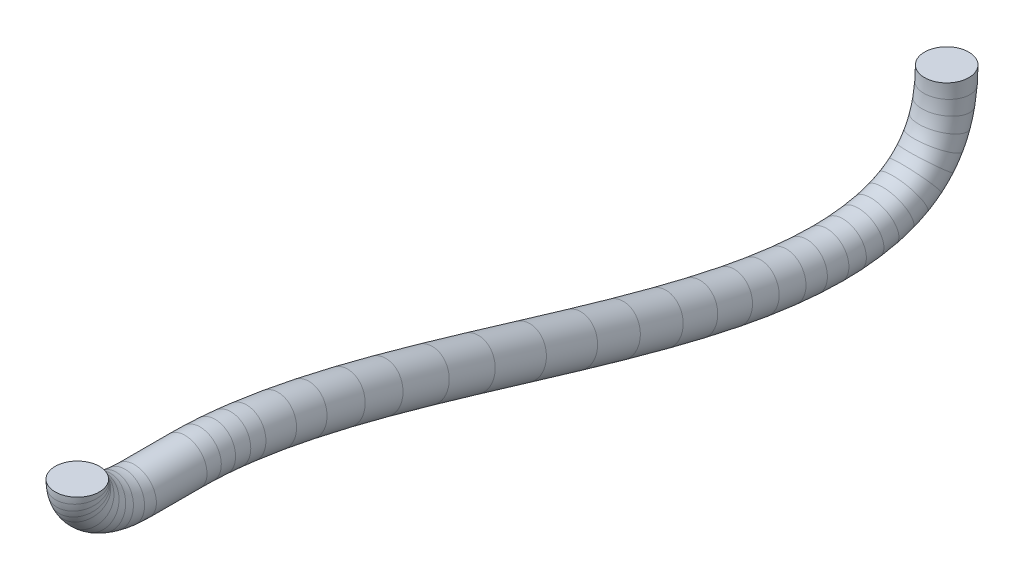
ISO-10303-21;
HEADER;
FILE_DESCRIPTION(('STEP AP214'),'2;1');
FILE_NAME('part.step','',(''),(''),'','','');
FILE_SCHEMA(('AUTOMOTIVE_DESIGN { 1 0 10303 214 1 1 1 1 }'));
ENDSEC;
DATA;
#1=APPLICATION_CONTEXT('core data for automotive mechanical design processes');
#2=APPLICATION_PROTOCOL_DEFINITION('international standard','automotive_design',2000,#1);
#3=PRODUCT_CONTEXT('',#1,'mechanical');
#4=PRODUCT('Part','Part','',(#3));
#5=PRODUCT_RELATED_PRODUCT_CATEGORY('part','',(#4));
#6=PRODUCT_DEFINITION_FORMATION('','',#4);
#7=PRODUCT_DEFINITION_CONTEXT('part definition',#1,'design');
#8=PRODUCT_DEFINITION('design','',#6,#7);
#9=PRODUCT_DEFINITION_SHAPE('','',#8);
#10=(LENGTH_UNIT() NAMED_UNIT(*) SI_UNIT(.MILLI.,.METRE.));
#11=(NAMED_UNIT(*) PLANE_ANGLE_UNIT() SI_UNIT($,.RADIAN.));
#12=(NAMED_UNIT(*) SI_UNIT($,.STERADIAN.) SOLID_ANGLE_UNIT());
#13=UNCERTAINTY_MEASURE_WITH_UNIT(LENGTH_MEASURE(1.E-05),#10,'distance_accuracy_value','');
#14=(GEOMETRIC_REPRESENTATION_CONTEXT(3) GLOBAL_UNCERTAINTY_ASSIGNED_CONTEXT((#13)) GLOBAL_UNIT_ASSIGNED_CONTEXT((#10,
#11,#12)) REPRESENTATION_CONTEXT('',''));
#15=CARTESIAN_POINT('',(0.,0.,0.));
#16=DIRECTION('',(0.,0.,1.));
#17=DIRECTION('',(1.,0.,0.));
#18=AXIS2_PLACEMENT_3D('',#15,#16,#17);
#19=CARTESIAN_POINT('',(-4.25000000000187,-230.95,242.824757540876));
#20=DIRECTION('',(0.,-1.,0.));
#21=DIRECTION('',(-1.,0.,0.));
#22=AXIS2_PLACEMENT_3D('',#19,#20,#21);
#23=PLANE('',#22);
#24=CARTESIAN_POINT('',(-4.25000000000187,-230.95,242.824757540876));
#25=DIRECTION('',(0.,-1.,0.));
#26=DIRECTION('',(0.,0.,1.));
#27=AXIS2_PLACEMENT_3D('',#24,#25,#26);
#28=CIRCLE('',#27,1.75);
#29=CARTESIAN_POINT('',(-4.25000000000187,-230.95,244.574757540876));
#30=VERTEX_POINT('',#29);
#31=EDGE_CURVE('E11',#30,#30,#28,.T.);
#32=ORIENTED_EDGE('',*,*,#31,.F.);
#33=EDGE_LOOP('',(#32));
#34=FACE_BOUND('',#33,.T.);
#35=ADVANCED_FACE('F43',(#34),#23,.F.);
#36=CARTESIAN_POINT('',(-4.25000000000187,-230.949999999997,256.889542028771));
#37=DIRECTION('',(1.,0.,0.));
#38=DIRECTION('',(0.,0.,-1.));
#39=AXIS2_PLACEMENT_3D('',#36,#37,#38);
#40=TOROIDAL_SURFACE('',#39,14.0647844878944,1.75);
#41=ORIENTED_EDGE('',*,*,#31,.T.);
#42=EDGE_LOOP('',(#41));
#43=FACE_BOUND('',#42,.T.);
#44=CARTESIAN_POINT('',(-4.25000000000187,-232.154264746609,242.876408577933));
#45=DIRECTION('',(0.,-0.996327633949824,0.0856226945847067));
#46=DIRECTION('',(0.,0.0856226945847067,0.996327633949824));
#47=AXIS2_PLACEMENT_3D('',#44,#45,#46);
#48=CIRCLE('',#47,1.75);
#49=CARTESIAN_POINT('',(-4.25000000000187,-232.004425031085,244.619981937345));
#50=VERTEX_POINT('',#49);
#51=EDGE_CURVE('E53',#50,#50,#48,.T.);
#52=ORIENTED_EDGE('',*,*,#51,.F.);
#53=EDGE_LOOP('',(#52));
#54=FACE_BOUND('',#53,.T.);
#55=ADVANCED_FACE('F282',(#43,#54),#40,.T.);
#56=CARTESIAN_POINT('',(-4.25000000000199,-231.277167470841,253.082537429018));
#57=DIRECTION('',(-1.,0.,0.));
#58=DIRECTION('',(0.,0.,1.));
#59=AXIS2_PLACEMENT_3D('',#56,#57,#58);
#60=TOROIDAL_SURFACE('',#59,10.2437476421527,1.75);
#61=CARTESIAN_POINT('',(-4.25000000000187,-233.346097740136,243.049896037195));
#62=DIRECTION('',(0.,-0.97939169748172,0.20197005447312));
#63=DIRECTION('',(0.,0.20197005447312,0.97939169748172));
#64=AXIS2_PLACEMENT_3D('',#61,#62,#63);
#65=CIRCLE('',#64,1.75);
#66=CARTESIAN_POINT('',(-4.25000000000187,-232.992650144808,244.763831507788));
#67=VERTEX_POINT('',#66);
#68=EDGE_CURVE('E210',#67,#67,#65,.T.);
#69=ORIENTED_EDGE('',*,*,#68,.F.);
#70=EDGE_LOOP('',(#69));
#71=FACE_BOUND('',#70,.T.);
#72=ORIENTED_EDGE('',*,*,#51,.T.);
#73=EDGE_LOOP('',(#72));
#74=FACE_BOUND('',#73,.T.);
#75=ADVANCED_FACE('F276',(#71,#74),#60,.T.);
#76=CARTESIAN_POINT('',(-4.25000000000187,-231.584241722187,251.593475235796));
#77=DIRECTION('',(-1.,0.,0.));
#78=DIRECTION('',(0.,1.,0.));
#79=AXIS2_PLACEMENT_3D('',#76,#77,#78);
#80=TOROIDAL_SURFACE('',#79,8.72335268980548,1.75);
#81=CARTESIAN_POINT('',(-4.25000000000187,-234.503096325618,243.372941800869));
#82=DIRECTION('',(0.,-0.942359403229759,0.334602383650285));
#83=DIRECTION('',(0.,0.334602383650285,0.942359403229759));
#84=AXIS2_PLACEMENT_3D('',#81,#82,#83);
#85=CIRCLE('',#84,1.75);
#86=CARTESIAN_POINT('',(-4.25000000000186,-233.91754215423,245.022070756521));
#87=VERTEX_POINT('',#86);
#88=EDGE_CURVE('E212',#87,#87,#85,.T.);
#89=ORIENTED_EDGE('',*,*,#88,.F.);
#90=EDGE_LOOP('',(#89));
#91=FACE_BOUND('',#90,.T.);
#92=ORIENTED_EDGE('',*,*,#68,.T.);
#93=EDGE_LOOP('',(#92));
#94=FACE_BOUND('',#93,.T.);
#95=ADVANCED_FACE('F273',(#91,#94),#80,.T.);
#96=CARTESIAN_POINT('',(-4.25000000000192,-232.255156456802,249.703940552774));
#97=DIRECTION('',(-1.,0.,0.));
#98=DIRECTION('',(0.,0.,1.));
#99=AXIS2_PLACEMENT_3D('',#96,#97,#98);
#100=TOROIDAL_SURFACE('',#99,6.71824224410275,1.75);
#101=CARTESIAN_POINT('',(-4.25000000000187,-235.592941489095,243.87350575521));
#102=DIRECTION('',(0.,-0.867851230384199,0.496824155935107));
#103=DIRECTION('',(0.,0.496824155935107,0.867851230384199));
#104=AXIS2_PLACEMENT_3D('',#101,#102,#103);
#105=CIRCLE('',#104,1.75);
#106=CARTESIAN_POINT('',(-4.25000000000187,-234.723499216209,245.392245408383));
#107=VERTEX_POINT('',#106);
#108=EDGE_CURVE('E262',#107,#107,#105,.T.);
#109=ORIENTED_EDGE('',*,*,#108,.F.);
#110=EDGE_LOOP('',(#109));
#111=FACE_BOUND('',#110,.T.);
#112=ORIENTED_EDGE('',*,*,#88,.T.);
#113=EDGE_LOOP('',(#112));
#114=FACE_BOUND('',#113,.T.);
#115=ADVANCED_FACE('F271',(#111,#114),#100,.T.);
#116=CARTESIAN_POINT('',(-4.25000000000187,-232.535257527852,249.214660681333));
#117=DIRECTION('',(-1.,0.,0.));
#118=DIRECTION('',(0.,1.,0.));
#119=AXIS2_PLACEMENT_3D('',#116,#117,#118);
#120=TOROIDAL_SURFACE('',#119,6.15445912746987,1.75);
#121=CARTESIAN_POINT('',(-4.25000000000188,-236.504884638056,244.511531110756));
#122=DIRECTION('',(0.,-0.76418243637133,0.645000158094227));
#123=DIRECTION('',(0.,0.645000158094227,0.76418243637133));
#124=AXIS2_PLACEMENT_3D('',#121,#122,#123);
#125=CIRCLE('',#124,1.75);
#126=CARTESIAN_POINT('',(-4.25000000000187,-235.376134361391,245.848850374406));
#127=VERTEX_POINT('',#126);
#128=EDGE_CURVE('E224',#127,#127,#125,.T.);
#129=ORIENTED_EDGE('',*,*,#128,.F.);
#130=EDGE_LOOP('',(#129));
#131=FACE_BOUND('',#130,.T.);
#132=ORIENTED_EDGE('',*,*,#108,.T.);
#133=EDGE_LOOP('',(#132));
#134=FACE_BOUND('',#133,.T.);
#135=ADVANCED_FACE('F331',(#131,#134),#120,.T.);
#136=CARTESIAN_POINT('',(-4.25000000000193,-232.617301362329,249.117456895365));
#137=DIRECTION('',(-1.,0.,0.));
#138=DIRECTION('',(0.,0.,1.));
#139=AXIS2_PLACEMENT_3D('',#136,#137,#138);
#140=TOROIDAL_SURFACE('',#139,6.02725941527647,1.75);
#141=CARTESIAN_POINT('',(-4.25000000000188,-237.285365654283,245.304710926223));
#142=DIRECTION('',(0.,-0.632583684630803,0.774492015413276));
#143=DIRECTION('',(0.,0.774492015413276,0.632583684630802));
#144=AXIS2_PLACEMENT_3D('',#141,#142,#143);
#145=CIRCLE('',#144,1.75);
#146=CARTESIAN_POINT('',(-4.25000000000188,-235.93000462731,246.411732374327));
#147=VERTEX_POINT('',#146);
#148=EDGE_CURVE('E222',#147,#147,#145,.T.);
#149=ORIENTED_EDGE('',*,*,#148,.F.);
#150=EDGE_LOOP('',(#149));
#151=FACE_BOUND('',#150,.T.);
#152=ORIENTED_EDGE('',*,*,#128,.T.);
#153=EDGE_LOOP('',(#152));
#154=FACE_BOUND('',#153,.T.);
#155=ADVANCED_FACE('F327',(#151,#154),#140,.T.);
#156=CARTESIAN_POINT('',(-4.25000000000188,-232.303168183887,249.374032198308));
#157=DIRECTION('',(-1.,0.,0.));
#158=DIRECTION('',(0.,0.,1.));
#159=AXIS2_PLACEMENT_3D('',#156,#157,#158);
#160=TOROIDAL_SURFACE('',#159,6.43285840427552,1.75);
#161=CARTESIAN_POINT('',(-4.25000000000188,-237.922658876016,246.243059248802));
#162=DIRECTION('',(0.,-0.486715663976958,0.873560451508348));
#163=DIRECTION('',(0.,0.873560451508348,0.486715663976958));
#164=AXIS2_PLACEMENT_3D('',#161,#162,#163);
#165=CIRCLE('',#164,1.75);
#166=CARTESIAN_POINT('',(-4.25000000000188,-236.393928085876,247.094811660761));
#167=VERTEX_POINT('',#166);
#168=EDGE_CURVE('E225',#167,#167,#165,.T.);
#169=ORIENTED_EDGE('',*,*,#168,.F.);
#170=EDGE_LOOP('',(#169));
#171=FACE_BOUND('',#170,.T.);
#172=ORIENTED_EDGE('',*,*,#148,.T.);
#173=EDGE_LOOP('',(#172));
#174=FACE_BOUND('',#173,.T.);
#175=ADVANCED_FACE('F330',(#171,#174),#160,.T.);
#176=CARTESIAN_POINT('',(-4.25000000000188,-230.891977966949,250.160295338137));
#177=DIRECTION('',(-1.,0.,0.));
#178=DIRECTION('',(0.,0.,1.));
#179=AXIS2_PLACEMENT_3D('',#176,#177,#178);
#180=TOROIDAL_SURFACE('',#179,8.04830495351097,1.75);
#181=CARTESIAN_POINT('',(-4.25000000000189,-238.404117197953,247.271874177933));
#182=DIRECTION('',(0.,-0.358885650691737,0.933381534918904));
#183=DIRECTION('',(0.,0.933381534918904,0.358885650691737));
#184=AXIS2_PLACEMENT_3D('',#181,#182,#183);
#185=CIRCLE('',#184,1.75);
#186=CARTESIAN_POINT('',(-4.25000000000188,-236.770699511845,247.899924066643));
#187=VERTEX_POINT('',#186);
#188=EDGE_CURVE('E209',#187,#187,#185,.T.);
#189=ORIENTED_EDGE('',*,*,#188,.F.);
#190=EDGE_LOOP('',(#189));
#191=FACE_BOUND('',#190,.T.);
#192=ORIENTED_EDGE('',*,*,#168,.T.);
#193=EDGE_LOOP('',(#192));
#194=FACE_BOUND('',#193,.T.);
#195=ADVANCED_FACE('F296',(#191,#194),#180,.T.);
#196=CARTESIAN_POINT('',(-4.2500000000019,-229.650055569719,250.637815099316));
#197=DIRECTION('',(-1.,0.,0.));
#198=DIRECTION('',(0.,0.,1.));
#199=AXIS2_PLACEMENT_3D('',#196,#197,#198);
#200=TOROIDAL_SURFACE('',#199,9.37886737709676,1.75);
#201=CARTESIAN_POINT('',(-4.2500000000019,-238.75714237465,248.396359499796));
#202=DIRECTION('',(0.,-0.238990009069875,0.971022026302587));
#203=DIRECTION('',(0.,0.971022026302586,0.238990009069875));
#204=AXIS2_PLACEMENT_3D('',#201,#202,#203);
#205=CIRCLE('',#204,1.75);
#206=CARTESIAN_POINT('',(-4.25000000000189,-237.057853828621,248.814592015668));
#207=VERTEX_POINT('',#206);
#208=EDGE_CURVE('E206',#207,#207,#205,.T.);
#209=ORIENTED_EDGE('',*,*,#208,.F.);
#210=EDGE_LOOP('',(#209));
#211=FACE_BOUND('',#210,.T.);
#212=ORIENTED_EDGE('',*,*,#188,.T.);
#213=EDGE_LOOP('',(#212));
#214=FACE_BOUND('',#213,.T.);
#215=ADVANCED_FACE('F325',(#211,#214),#200,.T.);
#216=CARTESIAN_POINT('',(-4.25000000000169,-226.243998497161,251.476121119785));
#217=DIRECTION('',(-1.,0.,0.));
#218=DIRECTION('',(0.,1.,0.));
#219=AXIS2_PLACEMENT_3D('',#216,#217,#218);
#220=TOROIDAL_SURFACE('',#219,12.8865705808288,1.75);
#221=CARTESIAN_POINT('',(-4.25000000000191,-238.986349474261,249.553572573952));
#222=DIRECTION('',(0.,-0.149190083876609,0.988808534991932));
#223=DIRECTION('',(0.,0.988808534991932,0.149190083876609));
#224=AXIS2_PLACEMENT_3D('',#221,#222,#223);
#225=CIRCLE('',#224,1.75);
#226=CARTESIAN_POINT('',(-4.2500000000019,-237.255934538026,249.814655220736));
#227=VERTEX_POINT('',#226);
#228=EDGE_CURVE('E196',#227,#227,#225,.T.);
#229=ORIENTED_EDGE('',*,*,#228,.F.);
#230=EDGE_LOOP('',(#229));
#231=FACE_BOUND('',#230,.T.);
#232=ORIENTED_EDGE('',*,*,#208,.T.);
#233=EDGE_LOOP('',(#232));
#234=FACE_BOUND('',#233,.T.);
#235=ADVANCED_FACE('F321',(#231,#234),#220,.T.);
#236=CARTESIAN_POINT('',(-4.25000000000191,-223.881282764538,251.832604448813));
#237=DIRECTION('',(-1.,0.,0.));
#238=DIRECTION('',(0.,0.,1.));
#239=AXIS2_PLACEMENT_3D('',#236,#237,#238);
#240=TOROIDAL_SURFACE('',#239,15.2760278407654,1.75);
#241=CARTESIAN_POINT('',(-4.25000000000191,-239.130219889069,250.923240295154));
#242=DIRECTION('',(0.,-0.0595288358427987,0.99822658635362));
#243=DIRECTION('',(0.,0.99822658635362,0.0595288358427987));
#244=AXIS2_PLACEMENT_3D('',#241,#242,#243);
#245=CIRCLE('',#244,1.75);
#246=CARTESIAN_POINT('',(-4.2500000000019,-237.38332336295,251.027415757879));
#247=VERTEX_POINT('',#246);
#248=EDGE_CURVE('E193',#247,#247,#245,.T.);
#249=ORIENTED_EDGE('',*,*,#248,.F.);
#250=EDGE_LOOP('',(#249));
#251=FACE_BOUND('',#250,.T.);
#252=ORIENTED_EDGE('',*,*,#228,.T.);
#253=EDGE_LOOP('',(#252));
#254=FACE_BOUND('',#253,.T.);
#255=ADVANCED_FACE('F324',(#251,#254),#240,.T.);
#256=CARTESIAN_POINT('',(-4.25000000000192,-217.547988332925,252.210287882334));
#257=DIRECTION('',(-1.,0.,0.));
#258=DIRECTION('',(0.,0.,1.));
#259=AXIS2_PLACEMENT_3D('',#256,#257,#258);
#260=TOROIDAL_SURFACE('',#259,21.6205737767215,1.75);
#261=CARTESIAN_POINT('',(-4.25000000000192,-239.168373417637,252.3006163022));
#262=DIRECTION('',(0.,0.00417789189117408,0.999991272571589));
#263=DIRECTION('',(0.,0.999991272571589,-0.00417789189117408));
#264=AXIS2_PLACEMENT_3D('',#261,#262,#263);
#265=CIRCLE('',#264,1.75);
#266=CARTESIAN_POINT('',(-4.25000000000191,-237.418388690636,252.293304991391));
#267=VERTEX_POINT('',#266);
#268=EDGE_CURVE('E197',#267,#267,#265,.T.);
#269=ORIENTED_EDGE('',*,*,#268,.F.);
#270=EDGE_LOOP('',(#269));
#271=FACE_BOUND('',#270,.T.);
#272=ORIENTED_EDGE('',*,*,#248,.T.);
#273=EDGE_LOOP('',(#272));
#274=FACE_BOUND('',#273,.T.);
#275=ADVANCED_FACE('F45',(#271,#274),#260,.T.);
#276=CARTESIAN_POINT('',(-4.25000000000152,-213.387296329698,252.192904809232));
#277=DIRECTION('',(-1.,0.,0.));
#278=DIRECTION('',(0.,1.,0.));
#279=AXIS2_PLACEMENT_3D('',#276,#277,#278);
#280=TOROIDAL_SURFACE('',#279,25.7813020924076,1.75);
#281=CARTESIAN_POINT('',(-4.25000000000192,-239.104795176421,254.005579807339));
#282=DIRECTION('',(0.,0.0703096760434265,0.997525212440602));
#283=DIRECTION('',(0.,0.997525212440602,-0.0703096760434265));
#284=AXIS2_PLACEMENT_3D('',#281,#282,#283);
#285=CIRCLE('',#284,1.75);
#286=CARTESIAN_POINT('',(-4.25000000000192,-237.359126054649,253.882537874263));
#287=VERTEX_POINT('',#286);
#288=EDGE_CURVE('E219',#287,#287,#285,.T.);
#289=ORIENTED_EDGE('',*,*,#288,.F.);
#290=EDGE_LOOP('',(#289));
#291=FACE_BOUND('',#290,.T.);
#292=ORIENTED_EDGE('',*,*,#268,.T.);
#293=EDGE_LOOP('',(#292));
#294=FACE_BOUND('',#293,.T.);
#295=ADVANCED_FACE('F358',(#291,#294),#280,.T.);
#296=CARTESIAN_POINT('',(-4.25000000000193,-202.110518557893,251.398071172912));
#297=DIRECTION('',(-1.,0.,0.));
#298=DIRECTION('',(0.,0.,1.));
#299=AXIS2_PLACEMENT_3D('',#296,#297,#298);
#300=TOROIDAL_SURFACE('',#299,37.0860567303507,1.75);
#301=CARTESIAN_POINT('',(-4.25000000000194,-238.945663426273,255.704775984275));
#302=DIRECTION('',(0.,0.116127331700109,0.993234334299924));
#303=DIRECTION('',(0.,0.993234334299924,-0.116127331700109));
#304=AXIS2_PLACEMENT_3D('',#301,#302,#303);
#305=CIRCLE('',#304,1.75);
#306=CARTESIAN_POINT('',(-4.25000000000192,-237.207503341248,255.5015531538));
#307=VERTEX_POINT('',#306);
#308=EDGE_CURVE('E221',#307,#307,#305,.T.);
#309=ORIENTED_EDGE('',*,*,#308,.F.);
#310=EDGE_LOOP('',(#309));
#311=FACE_BOUND('',#310,.T.);
#312=ORIENTED_EDGE('',*,*,#288,.T.);
#313=EDGE_LOOP('',(#312));
#314=FACE_BOUND('',#313,.T.);
#315=ADVANCED_FACE('F337',(#311,#314),#300,.T.);
#316=CARTESIAN_POINT('',(-4.25000000000194,-194.742283808802,250.536589233362));
#317=DIRECTION('',(-1.,0.,0.));
#318=DIRECTION('',(0.,0.,1.));
#319=AXIS2_PLACEMENT_3D('',#316,#317,#318);
#320=TOROIDAL_SURFACE('',#319,44.5044820652765,1.75);
#321=CARTESIAN_POINT('',(-4.25000000000195,-238.644029136113,257.836293413291));
#322=DIRECTION('',(0.,0.164021775812254,0.986456718289959));
#323=DIRECTION('',(0.,0.986456718289959,-0.164021775812254));
#324=AXIS2_PLACEMENT_3D('',#321,#322,#323);
#325=CIRCLE('',#324,1.75);
#326=CARTESIAN_POINT('',(-4.25000000000193,-236.917729879106,257.54925530562));
#327=VERTEX_POINT('',#326);
#328=EDGE_CURVE('E245',#327,#327,#325,.T.);
#329=ORIENTED_EDGE('',*,*,#328,.F.);
#330=EDGE_LOOP('',(#329));
#331=FACE_BOUND('',#330,.T.);
#332=ORIENTED_EDGE('',*,*,#308,.T.);
#333=EDGE_LOOP('',(#332));
#334=FACE_BOUND('',#333,.T.);
#335=ADVANCED_FACE('F333',(#331,#334),#320,.T.);
#336=CARTESIAN_POINT('',(-4.25000000000359,-174.11323986088,247.106522450979));
#337=DIRECTION('',(-1.,0.,0.));
#338=DIRECTION('',(0.,1.,0.));
#339=AXIS2_PLACEMENT_3D('',#336,#337,#338);
#340=TOROIDAL_SURFACE('',#339,65.4167467044053,1.75);
#341=CARTESIAN_POINT('',(-4.25000000000196,-238.255969944217,259.95412638496));
#342=DIRECTION('',(0.,0.196396252966238,0.980524610512567));
#343=DIRECTION('',(0.,0.980524610512567,-0.196396252966239));
#344=AXIS2_PLACEMENT_3D('',#341,#342,#343);
#345=CIRCLE('',#344,1.75);
#346=CARTESIAN_POINT('',(-4.25000000000194,-236.54005187582,259.610432942269));
#347=VERTEX_POINT('',#346);
#348=EDGE_CURVE('E254',#347,#347,#345,.T.);
#349=ORIENTED_EDGE('',*,*,#348,.F.);
#350=EDGE_LOOP('',(#349));
#351=FACE_BOUND('',#350,.T.);
#352=ORIENTED_EDGE('',*,*,#328,.T.);
#353=EDGE_LOOP('',(#352));
#354=FACE_BOUND('',#353,.T.);
#355=ADVANCED_FACE('F336',(#351,#354),#340,.T.);
#356=CARTESIAN_POINT('',(-4.25000000000196,-159.723228065321,244.22424456986));
#357=DIRECTION('',(-1.,0.,0.));
#358=DIRECTION('',(0.,0.,1.));
#359=AXIS2_PLACEMENT_3D('',#356,#357,#358);
#360=TOROIDAL_SURFACE('',#359,80.0925759913752,1.75);
#361=CARTESIAN_POINT('',(-4.25000000000196,-237.652659422165,262.712739839436));
#362=DIRECTION('',(0.,0.230839063930067,0.972991945785725));
#363=DIRECTION('',(0.,0.972991945785725,-0.230839063930067));
#364=AXIS2_PLACEMENT_3D('',#361,#362,#363);
#365=CIRCLE('',#364,1.75);
#366=CARTESIAN_POINT('',(-4.25000000000195,-235.94992351704,262.308771477558));
#367=VERTEX_POINT('',#366);
#368=EDGE_CURVE('E251',#367,#367,#365,.T.);
#369=ORIENTED_EDGE('',*,*,#368,.F.);
#370=EDGE_LOOP('',(#369));
#371=FACE_BOUND('',#370,.T.);
#372=ORIENTED_EDGE('',*,*,#348,.T.);
#373=EDGE_LOOP('',(#372));
#374=FACE_BOUND('',#373,.T.);
#375=ADVANCED_FACE('F400',(#371,#374),#360,.T.);
#376=CARTESIAN_POINT('',(-4.25000000000197,-114.101961776169,233.400752709387));
#377=DIRECTION('',(-1.,0.,0.));
#378=DIRECTION('',(0.,0.,1.));
#379=AXIS2_PLACEMENT_3D('',#376,#377,#378);
#380=TOROIDAL_SURFACE('',#379,126.980185376793,1.75);
#381=CARTESIAN_POINT('',(-4.25000000000198,-236.970235854658,265.453127087863));
#382=DIRECTION('',(0.,0.252420283395877,0.967617693373961));
#383=DIRECTION('',(0.,0.967617693373961,-0.252420283395877));
#384=AXIS2_PLACEMENT_3D('',#381,#382,#383);
#385=CIRCLE('',#384,1.75);
#386=CARTESIAN_POINT('',(-4.25000000000197,-235.276904891253,265.011391591921));
#387=VERTEX_POINT('',#386);
#388=EDGE_CURVE('E226',#387,#387,#385,.T.);
#389=ORIENTED_EDGE('',*,*,#388,.F.);
#390=EDGE_LOOP('',(#389));
#391=FACE_BOUND('',#390,.T.);
#392=ORIENTED_EDGE('',*,*,#368,.T.);
#393=EDGE_LOOP('',(#392));
#394=FACE_BOUND('',#393,.T.);
#395=ADVANCED_FACE('F396',(#391,#394),#380,.T.);
#396=CARTESIAN_POINT('',(-4.2499999999981,-77.7247518364724,223.911110565486));
#397=DIRECTION('',(-1.,0.,0.));
#398=DIRECTION('',(0.,1.,0.));
#399=AXIS2_PLACEMENT_3D('',#396,#397,#398);
#400=TOROIDAL_SURFACE('',#399,164.574795509311,1.75);
#401=CARTESIAN_POINT('',(-4.25000000000199,-236.04549732986,268.848899377903));
#402=DIRECTION('',(0.,0.273053894268858,0.961998737434001));
#403=DIRECTION('',(0.,0.961998737434001,-0.273053894268858));
#404=AXIS2_PLACEMENT_3D('',#401,#402,#403);
#405=CIRCLE('',#404,1.75);
#406=CARTESIAN_POINT('',(-4.25000000000198,-234.361999539351,268.371055062932));
#407=VERTEX_POINT('',#406);
#408=EDGE_CURVE('E187',#407,#407,#405,.T.);
#409=ORIENTED_EDGE('',*,*,#408,.F.);
#410=EDGE_LOOP('',(#409));
#411=FACE_BOUND('',#410,.T.);
#412=ORIENTED_EDGE('',*,*,#388,.T.);
#413=EDGE_LOOP('',(#412));
#414=FACE_BOUND('',#413,.T.);
#415=ADVANCED_FACE('F399',(#411,#414),#400,.T.);
#416=CARTESIAN_POINT('',(-4.250000000002,89.1154384764909,176.555161006842));
#417=DIRECTION('',(-1.,0.,0.));
#418=DIRECTION('',(0.,0.,1.));
#419=AXIS2_PLACEMENT_3D('',#416,#417,#418);
#420=TOROIDAL_SURFACE('',#419,338.005574387418,1.75);
#421=CARTESIAN_POINT('',(-4.25000000000201,-235.06684543233,272.229688006609));
#422=DIRECTION('',(0.,0.283056062531411,0.95910336537008));
#423=DIRECTION('',(0.,0.95910336537008,-0.283056062531411));
#424=AXIS2_PLACEMENT_3D('',#421,#422,#423);
#425=CIRCLE('',#424,1.75);
#426=CARTESIAN_POINT('',(-4.250000000002,-233.388414542932,271.734339897179));
#427=VERTEX_POINT('',#426);
#428=EDGE_CURVE('E185',#427,#427,#425,.T.);
#429=ORIENTED_EDGE('',*,*,#428,.F.);
#430=EDGE_LOOP('',(#429));
#431=FACE_BOUND('',#430,.T.);
#432=ORIENTED_EDGE('',*,*,#408,.T.);
#433=EDGE_LOOP('',(#432));
#434=FACE_BOUND('',#433,.T.);
#435=ADVANCED_FACE('F313',(#431,#434),#420,.T.);
#436=CARTESIAN_POINT('',(-4.25000000000202,355.624618688653,97.9014497354828));
#437=DIRECTION('',(-1.,0.,0.));
#438=DIRECTION('',(0.,0.,1.));
#439=AXIS2_PLACEMENT_3D('',#436,#437,#438);
#440=TOROIDAL_SURFACE('',#439,615.878835846877,1.75);
#441=CARTESIAN_POINT('',(-4.25000000000203,-233.857534134273,276.276145102714));
#442=DIRECTION('',(0.,0.28962627871776,0.957139811457084));
#443=DIRECTION('',(0.,0.957139811457084,-0.28962627871776));
#444=AXIS2_PLACEMENT_3D('',#441,#442,#443);
#445=CIRCLE('',#444,1.75);
#446=CARTESIAN_POINT('',(-4.25000000000201,-232.182539464223,275.769299114958));
#447=VERTEX_POINT('',#446);
#448=EDGE_CURVE('E188',#447,#447,#445,.T.);
#449=ORIENTED_EDGE('',*,*,#448,.F.);
#450=EDGE_LOOP('',(#449));
#451=FACE_BOUND('',#450,.T.);
#452=ORIENTED_EDGE('',*,*,#428,.T.);
#453=EDGE_LOOP('',(#452));
#454=FACE_BOUND('',#453,.T.);
#455=ADVANCED_FACE('F309',(#451,#454),#440,.T.);
#456=CARTESIAN_POINT('',(-4.2499999999175,-1115.67701243899,543.110823737272));
#457=DIRECTION('',(1.,0.,0.));
#458=DIRECTION('',(0.,-1.,0.));
#459=AXIS2_PLACEMENT_3D('',#456,#457,#458);
#460=TOROIDAL_SURFACE('',#459,921.306864209537,1.75);
#461=CARTESIAN_POINT('',(-4.25000000000204,-232.643620231672,280.321238162713));
#462=DIRECTION('',(0.,0.285235675307392,0.958457411433568));
#463=DIRECTION('',(0.,0.958457411433568,-0.285235675307392));
#464=AXIS2_PLACEMENT_3D('',#461,#462,#463);
#465=CIRCLE('',#464,1.75);
#466=CARTESIAN_POINT('',(-4.25000000000203,-230.966319761663,279.822075730926));
#467=VERTEX_POINT('',#466);
#468=EDGE_CURVE('E216',#467,#467,#465,.T.);
#469=ORIENTED_EDGE('',*,*,#468,.F.);
#470=EDGE_LOOP('',(#469));
#471=FACE_BOUND('',#470,.T.);
#472=ORIENTED_EDGE('',*,*,#448,.T.);
#473=EDGE_LOOP('',(#472));
#474=FACE_BOUND('',#473,.T.);
#475=ADVANCED_FACE('F312',(#471,#474),#460,.T.);
#476=CARTESIAN_POINT('',(-4.25000000000205,-641.725473173931,402.063463939763));
#477=DIRECTION('',(1.,0.,0.));
#478=DIRECTION('',(0.,0.,-1.));
#479=AXIS2_PLACEMENT_3D('',#476,#477,#478);
#480=TOROIDAL_SURFACE('',#479,426.812759818426,1.75);
#481=CARTESIAN_POINT('',(-4.25000000000205,-231.58113500926,283.950154718124));
#482=DIRECTION('',(0.,0.276733313388875,0.96094675880655));
#483=DIRECTION('',(0.,0.96094675880655,-0.276733313388875));
#484=AXIS2_PLACEMENT_3D('',#481,#482,#483);
#485=CIRCLE('',#484,1.75);
#486=CARTESIAN_POINT('',(-4.25000000000204,-229.899478181349,283.465871419693));
#487=VERTEX_POINT('',#486);
#488=EDGE_CURVE('E218',#487,#487,#485,.T.);
#489=ORIENTED_EDGE('',*,*,#488,.F.);
#490=EDGE_LOOP('',(#489));
#491=FACE_BOUND('',#490,.T.);
#492=ORIENTED_EDGE('',*,*,#468,.T.);
#493=EDGE_LOOP('',(#492));
#494=FACE_BOUND('',#493,.T.);
#495=ADVANCED_FACE('F386',(#491,#494),#480,.T.);
#496=CARTESIAN_POINT('',(-4.24999999999743,-417.149501155132,337.390106883215));
#497=DIRECTION('',(1.,0.,0.));
#498=DIRECTION('',(0.,-1.,0.));
#499=AXIS2_PLACEMENT_3D('',#496,#497,#498);
#500=TOROIDAL_SURFACE('',#499,193.109935014891,1.75);
#501=CARTESIAN_POINT('',(-4.25000000000207,-230.570396712221,287.593673409155));
#502=DIRECTION('',(0.,0.257865725396845,0.96618076345245));
#503=DIRECTION('',(0.,0.96618076345245,-0.257865725396845));
#504=AXIS2_PLACEMENT_3D('',#501,#502,#503);
#505=CIRCLE('',#504,1.75);
#506=CARTESIAN_POINT('',(-4.25000000000205,-228.879580376179,287.142408389711));
#507=VERTEX_POINT('',#506);
#508=EDGE_CURVE('E227',#507,#507,#505,.T.);
#509=ORIENTED_EDGE('',*,*,#508,.F.);
#510=EDGE_LOOP('',(#509));
#511=FACE_BOUND('',#510,.T.);
#512=ORIENTED_EDGE('',*,*,#488,.T.);
#513=EDGE_LOOP('',(#512));
#514=FACE_BOUND('',#513,.T.);
#515=ADVANCED_FACE('F382',(#511,#514),#500,.T.);
#516=CARTESIAN_POINT('',(-4.25000000000207,-373.950300428868,325.860594339182));
#517=DIRECTION('',(1.,0.,0.));
#518=DIRECTION('',(0.,0.,-1.));
#519=AXIS2_PLACEMENT_3D('',#516,#517,#518);
#520=TOROIDAL_SURFACE('',#519,148.398632161014,1.75);
#521=CARTESIAN_POINT('',(-4.25000000000207,-229.807377478257,290.576436555352));
#522=DIRECTION('',(0.,0.237766058016081,0.97132244988752));
#523=DIRECTION('',(0.,0.97132244988752,-0.237766058016081));
#524=AXIS2_PLACEMENT_3D('',#521,#522,#523);
#525=CIRCLE('',#524,1.75);
#526=CARTESIAN_POINT('',(-4.25000000000206,-228.107563190954,290.160345953823));
#527=VERTEX_POINT('',#526);
#528=EDGE_CURVE('E230',#527,#527,#525,.T.);
#529=ORIENTED_EDGE('',*,*,#528,.F.);
#530=EDGE_LOOP('',(#529));
#531=FACE_BOUND('',#530,.T.);
#532=ORIENTED_EDGE('',*,*,#508,.T.);
#533=EDGE_LOOP('',(#532));
#534=FACE_BOUND('',#533,.T.);
#535=ADVANCED_FACE('F379',(#531,#534),#520,.T.);
#536=CARTESIAN_POINT('',(-4.25000000000207,-321.794207543906,313.093517239195));
#537=DIRECTION('',(1.,0.,0.));
#538=DIRECTION('',(0.,0.,-1.));
#539=AXIS2_PLACEMENT_3D('',#536,#537,#538);
#540=TOROIDAL_SURFACE('',#539,94.7026706489815,1.75);
#541=CARTESIAN_POINT('',(-4.25000000000208,-229.124098525202,293.578222660046));
#542=DIRECTION('',(0.,0.206069104972151,0.978537441274465));
#543=DIRECTION('',(0.,0.978537441274465,-0.206069104972151));
#544=AXIS2_PLACEMENT_3D('',#541,#542,#543);
#545=CIRCLE('',#544,1.75);
#546=CARTESIAN_POINT('',(-4.25000000000207,-227.411658002972,293.217601726345));
#547=VERTEX_POINT('',#546);
#548=EDGE_CURVE('E201',#547,#547,#545,.T.);
#549=ORIENTED_EDGE('',*,*,#548,.F.);
#550=EDGE_LOOP('',(#549));
#551=FACE_BOUND('',#550,.T.);
#552=ORIENTED_EDGE('',*,*,#528,.T.);
#553=EDGE_LOOP('',(#552));
#554=FACE_BOUND('',#553,.T.);
#555=ADVANCED_FACE('F307',(#551,#554),#540,.T.);
#556=CARTESIAN_POINT('',(-4.25000000000027,-305.384304177313,309.637774048548));
#557=DIRECTION('',(1.,0.,0.));
#558=DIRECTION('',(0.,-1.,0.));
#559=AXIS2_PLACEMENT_3D('',#556,#557,#558);
#560=TOROIDAL_SURFACE('',#559,77.9328438907639,1.75);
#561=CARTESIAN_POINT('',(-4.25000000000209,-228.658737258291,295.973384641894));
#562=DIRECTION('',(0.,0.175335439135392,0.984508752517315));
#563=DIRECTION('',(0.,0.984508752517315,-0.175335439135392));
#564=AXIS2_PLACEMENT_3D('',#561,#562,#563);
#565=CIRCLE('',#564,1.75);
#566=CARTESIAN_POINT('',(-4.25000000000207,-226.935846941385,295.666547623408));
#567=VERTEX_POINT('',#566);
#568=EDGE_CURVE('E198',#567,#567,#565,.T.);
#569=ORIENTED_EDGE('',*,*,#568,.F.);
#570=EDGE_LOOP('',(#569));
#571=FACE_BOUND('',#570,.T.);
#572=ORIENTED_EDGE('',*,*,#548,.T.);
#573=EDGE_LOOP('',(#572));
#574=FACE_BOUND('',#573,.T.);
#575=ADVANCED_FACE('F303',(#571,#574),#560,.T.);
#576=CARTESIAN_POINT('',(-4.25000000000209,-281.665797849901,305.413642254981));
#577=DIRECTION('',(1.,0.,0.));
#578=DIRECTION('',(0.,0.,-1.));
#579=AXIS2_PLACEMENT_3D('',#576,#577,#578);
#580=TOROIDAL_SURFACE('',#579,53.8411268117981,1.75);
#581=CARTESIAN_POINT('',(-4.25000000000209,-228.285509846019,298.384290294326));
#582=DIRECTION('',(0.,0.130557296566827,0.991440765912499));
#583=DIRECTION('',(0.,0.991440765912499,-0.130557296566827));
#584=AXIS2_PLACEMENT_3D('',#581,#582,#583);
#585=CIRCLE('',#584,1.75);
#586=CARTESIAN_POINT('',(-4.25000000000207,-226.550488505673,298.155815025334));
#587=VERTEX_POINT('',#586);
#588=EDGE_CURVE('E202',#587,#587,#585,.T.);
#589=ORIENTED_EDGE('',*,*,#588,.F.);
#590=EDGE_LOOP('',(#589));
#591=FACE_BOUND('',#590,.T.);
#592=ORIENTED_EDGE('',*,*,#568,.T.);
#593=EDGE_LOOP('',(#592));
#594=FACE_BOUND('',#593,.T.);
#595=ADVANCED_FACE('F306',(#591,#594),#580,.T.);
#596=CARTESIAN_POINT('',(-4.25000000000209,-274.364382111561,304.452159599978));
#597=DIRECTION('',(1.,0.,0.));
#598=DIRECTION('',(0.,0.,-1.));
#599=AXIS2_PLACEMENT_3D('',#596,#597,#598);
#600=TOROIDAL_SURFACE('',#599,46.4766770238004,1.75);
#601=CARTESIAN_POINT('',(-4.25000000000209,-228.144064286419,299.577354237972));
#602=DIRECTION('',(0.,0.104887132087639,0.994484132363322));
#603=DIRECTION('',(0.,0.994484132363322,-0.104887132087639));
#604=AXIS2_PLACEMENT_3D('',#601,#602,#603);
#605=CIRCLE('',#604,1.75);
#606=CARTESIAN_POINT('',(-4.25000000000208,-226.403717054783,299.393801756818));
#607=VERTEX_POINT('',#606);
#608=EDGE_CURVE('E239',#607,#607,#605,.T.);
#609=ORIENTED_EDGE('',*,*,#608,.F.);
#610=EDGE_LOOP('',(#609));
#611=FACE_BOUND('',#610,.T.);
#612=ORIENTED_EDGE('',*,*,#588,.T.);
#613=EDGE_LOOP('',(#612));
#614=FACE_BOUND('',#613,.T.);
#615=ADVANCED_FACE('F362',(#611,#614),#600,.T.);
#616=CARTESIAN_POINT('',(-4.25000000000032,-265.880395591307,303.557363005643));
#617=DIRECTION('',(1.,0.,0.));
#618=DIRECTION('',(0.,-1.,0.));
#619=AXIS2_PLACEMENT_3D('',#616,#617,#618);
#620=TOROIDAL_SURFACE('',#619,37.9456344016418,1.75);
#621=CARTESIAN_POINT('',(-4.25000000000209,-228.036984849377,300.773941808523));
#622=DIRECTION('',(0.,0.0733528702570044,0.997306049527957));
#623=DIRECTION('',(0.,0.997306049527957,-0.0733528702570044));
#624=AXIS2_PLACEMENT_3D('',#621,#622,#623);
#625=CIRCLE('',#624,1.75);
#626=CARTESIAN_POINT('',(-4.25000000000208,-226.291699262703,300.645574285573));
#627=VERTEX_POINT('',#626);
#628=EDGE_CURVE('E248',#627,#627,#625,.T.);
#629=ORIENTED_EDGE('',*,*,#628,.F.);
#630=EDGE_LOOP('',(#629));
#631=FACE_BOUND('',#630,.T.);
#632=ORIENTED_EDGE('',*,*,#608,.T.);
#633=EDGE_LOOP('',(#632));
#634=FACE_BOUND('',#633,.T.);
#635=ADVANCED_FACE('F356',(#631,#634),#620,.T.);
#636=CARTESIAN_POINT('',(-4.25000000000209,-262.210681003385,303.287451780142));
#637=DIRECTION('',(1.,0.,0.));
#638=DIRECTION('',(0.,0.,-1.));
#639=AXIS2_PLACEMENT_3D('',#636,#637,#638);
#640=TOROIDAL_SURFACE('',#639,34.2660070799602,1.75);
#641=CARTESIAN_POINT('',(-4.25000000000209,-227.972831966545,301.898590903582));
#642=DIRECTION('',(0.,0.0405317396118426,0.999178251406644));
#643=DIRECTION('',(0.,0.999178251406644,-0.0405317396118426));
#644=AXIS2_PLACEMENT_3D('',#641,#642,#643);
#645=CIRCLE('',#644,1.75);
#646=CARTESIAN_POINT('',(-4.25000000000208,-226.224270026583,301.827660359262));
#647=VERTEX_POINT('',#646);
#648=EDGE_CURVE('E241',#647,#647,#645,.T.);
#649=ORIENTED_EDGE('',*,*,#648,.F.);
#650=EDGE_LOOP('',(#649));
#651=FACE_BOUND('',#650,.T.);
#652=ORIENTED_EDGE('',*,*,#628,.T.);
#653=EDGE_LOOP('',(#652));
#654=FACE_BOUND('',#653,.T.);
#655=ADVANCED_FACE('F352',(#651,#654),#640,.T.);
#656=CARTESIAN_POINT('',(-4.25000000000101,-255.734808680971,303.024757540721));
#657=DIRECTION('',(1.,0.,0.));
#658=DIRECTION('',(0.,-1.,0.));
#659=AXIS2_PLACEMENT_3D('',#656,#657,#658);
#660=TOROIDAL_SURFACE('',#659,27.7848088420089,1.75);
#661=CARTESIAN_POINT('',(-4.25000000000209,-227.949999838962,303.024757540732));
#662=DIRECTION('',(0.,0.,1.));
#663=DIRECTION('',(0.,1.,0.));
#664=AXIS2_PLACEMENT_3D('',#661,#662,#663);
#665=CIRCLE('',#664,1.75);
#666=CARTESIAN_POINT('',(-4.25000000000208,-226.199999838962,303.024757540732));
#667=VERTEX_POINT('',#666);
#668=EDGE_CURVE('E240',#667,#667,#665,.T.);
#669=ORIENTED_EDGE('',*,*,#668,.F.);
#670=EDGE_LOOP('',(#669));
#671=FACE_BOUND('',#670,.T.);
#672=ORIENTED_EDGE('',*,*,#648,.T.);
#673=EDGE_LOOP('',(#672));
#674=FACE_BOUND('',#673,.T.);
#675=ADVANCED_FACE('F355',(#671,#674),#660,.T.);
#676=CARTESIAN_POINT('',(-4.25000000000209,-224.94999983895,311.524757540734));
#677=DIRECTION('',(0.,1.,0.));
#678=DIRECTION('',(0.,0.,-1.));
#679=AXIS2_PLACEMENT_3D('',#676,#677,#678);
#680=PLANE('',#679);
#681=CARTESIAN_POINT('',(-4.25000000000209,-224.94999983895,311.524757540734));
#682=DIRECTION('',(0.,1.,0.));
#683=DIRECTION('',(1.,0.,0.));
#684=AXIS2_PLACEMENT_3D('',#681,#682,#683);
#685=CIRCLE('',#684,1.75);
#686=CARTESIAN_POINT('',(-2.50000000000209,-224.94999983895,311.524757540734));
#687=VERTEX_POINT('',#686);
#688=EDGE_CURVE('E173',#687,#687,#685,.T.);
#689=ORIENTED_EDGE('',*,*,#688,.T.);
#690=EDGE_LOOP('',(#689));
#691=FACE_BOUND('',#690,.T.);
#692=ADVANCED_FACE('F374',(#691),#680,.T.);
#693=CARTESIAN_POINT('',(-4.25000000000209,-227.949999838949,307.024757540733));
#694=DIRECTION('',(0.,0.,-1.));
#695=DIRECTION('',(-1.,0.,0.));
#696=AXIS2_PLACEMENT_3D('',#693,#694,#695);
#697=CYLINDRICAL_SURFACE('',#696,1.75);
#698=ORIENTED_EDGE('',*,*,#668,.T.);
#699=EDGE_LOOP('',(#698));
#700=FACE_BOUND('',#699,.T.);
#701=CARTESIAN_POINT('',(-4.25000000000209,-227.949999838949,307.024757540733));
#702=DIRECTION('',(0.,0.,1.));
#703=DIRECTION('',(1.,0.,0.));
#704=AXIS2_PLACEMENT_3D('',#701,#702,#703);
#705=CIRCLE('',#704,1.75);
#706=CARTESIAN_POINT('',(-2.50000000000209,-227.949999838949,307.024757540733));
#707=VERTEX_POINT('',#706);
#708=EDGE_CURVE('E183',#707,#707,#705,.T.);
#709=ORIENTED_EDGE('',*,*,#708,.F.);
#710=EDGE_LOOP('',(#709));
#711=FACE_BOUND('',#710,.T.);
#712=ADVANCED_FACE('F350',(#700,#711),#697,.T.);
#713=CARTESIAN_POINT('',(-4.25000000000209,-220.205305988971,307.024757540735));
#714=DIRECTION('',(-1.,0.,0.));
#715=DIRECTION('',(0.,0.,1.));
#716=AXIS2_PLACEMENT_3D('',#713,#714,#715);
#717=TOROIDAL_SURFACE('',#716,7.74469384997811,1.75);
#718=CARTESIAN_POINT('',(-4.25000000000209,-227.891785257086,307.972554613281));
#719=DIRECTION('',(0.,0.12238018582888,0.992483294628423));
#720=DIRECTION('',(1.,0.,0.));
#721=AXIS2_PLACEMENT_3D('',#718,#719,#720);
#722=CIRCLE('',#721,1.75);
#723=CARTESIAN_POINT('',(-2.50000000000209,-227.891785257086,307.972554613281));
#724=VERTEX_POINT('',#723);
#725=EDGE_CURVE('E191',#724,#724,#722,.T.);
#726=ORIENTED_EDGE('',*,*,#725,.F.);
#727=EDGE_LOOP('',(#726));
#728=FACE_BOUND('',#727,.T.);
#729=ORIENTED_EDGE('',*,*,#708,.T.);
#730=EDGE_LOOP('',(#729));
#731=FACE_BOUND('',#730,.T.);
#732=ADVANCED_FACE('F347',(#728,#731),#717,.T.);
#733=CARTESIAN_POINT('',(-4.25000000000209,-221.440613930527,307.177079717098));
#734=DIRECTION('',(-1.,0.,0.));
#735=DIRECTION('',(0.,0.,1.));
#736=AXIS2_PLACEMENT_3D('',#733,#734,#735);
#737=TOROIDAL_SURFACE('',#736,6.50003013801245,1.75);
#738=CARTESIAN_POINT('',(-4.25000000000209,-227.707244246766,308.903270979579));
#739=DIRECTION('',(0.,0.265566655204551,0.9640925016011));
#740=DIRECTION('',(1.,0.,0.));
#741=AXIS2_PLACEMENT_3D('',#738,#739,#740);
#742=CIRCLE('',#741,1.75);
#743=CARTESIAN_POINT('',(-2.50000000000209,-227.707244246766,308.903270979579));
#744=VERTEX_POINT('',#743);
#745=EDGE_CURVE('E189',#744,#744,#742,.T.);
#746=ORIENTED_EDGE('',*,*,#745,.F.);
#747=EDGE_LOOP('',(#746));
#748=FACE_BOUND('',#747,.T.);
#749=ORIENTED_EDGE('',*,*,#725,.T.);
#750=EDGE_LOOP('',(#749));
#751=FACE_BOUND('',#750,.T.);
#752=ADVANCED_FACE('F345',(#748,#751),#737,.T.);
#753=CARTESIAN_POINT('',(-4.25000000000209,-222.199241247956,307.386049415445));
#754=DIRECTION('',(-1.,0.,0.));
#755=DIRECTION('',(0.,0.,1.));
#756=AXIS2_PLACEMENT_3D('',#753,#754,#755);
#757=TOROIDAL_SURFACE('',#756,5.71314784593998,1.75);
#758=CARTESIAN_POINT('',(-4.25000000000209,-227.474199901937,309.580330506911));
#759=DIRECTION('',(0.,0.384075670827617,0.923301618691485));
#760=DIRECTION('',(1.,0.,0.));
#761=AXIS2_PLACEMENT_3D('',#758,#759,#760);
#762=CIRCLE('',#761,1.75);
#763=CARTESIAN_POINT('',(-2.50000000000209,-227.474199901937,309.580330506911));
#764=VERTEX_POINT('',#763);
#765=EDGE_CURVE('E192',#764,#764,#762,.T.);
#766=ORIENTED_EDGE('',*,*,#765,.F.);
#767=EDGE_LOOP('',(#766));
#768=FACE_BOUND('',#767,.T.);
#769=ORIENTED_EDGE('',*,*,#745,.T.);
#770=EDGE_LOOP('',(#769));
#771=FACE_BOUND('',#770,.T.);
#772=ADVANCED_FACE('F342',(#768,#771),#757,.T.);
#773=CARTESIAN_POINT('',(-4.25000000000209,-223.586192797706,307.962994517772));
#774=DIRECTION('',(-1.,0.,0.));
#775=DIRECTION('',(0.,0.,1.));
#776=AXIS2_PLACEMENT_3D('',#773,#774,#775);
#777=TOROIDAL_SURFACE('',#776,4.21098265780242,1.75);
#778=CARTESIAN_POINT('',(-4.25000000000209,-227.144603939793,310.214679462027));
#779=DIRECTION('',(0.,0.534717220951684,0.845031060741384));
#780=DIRECTION('',(1.,0.,0.));
#781=AXIS2_PLACEMENT_3D('',#778,#779,#780);
#782=CIRCLE('',#781,1.75);
#783=CARTESIAN_POINT('',(-2.50000000000209,-227.144603939793,310.214679462027));
#784=VERTEX_POINT('',#783);
#785=EDGE_CURVE('E203',#784,#784,#782,.T.);
#786=ORIENTED_EDGE('',*,*,#785,.F.);
#787=EDGE_LOOP('',(#786));
#788=FACE_BOUND('',#787,.T.);
#789=ORIENTED_EDGE('',*,*,#765,.T.);
#790=EDGE_LOOP('',(#789));
#791=FACE_BOUND('',#790,.T.);
#792=ADVANCED_FACE('F301',(#788,#791),#777,.T.);
#793=CARTESIAN_POINT('',(-4.25000000000209,-224.175188521684,308.335698163008));
#794=DIRECTION('',(-1.,0.,0.));
#795=DIRECTION('',(0.,0.,1.));
#796=AXIS2_PLACEMENT_3D('',#793,#794,#795);
#797=TOROIDAL_SURFACE('',#796,3.51397191897811,1.75);
#798=CARTESIAN_POINT('',(-4.25000000000209,-226.722978671786,310.755773368122));
#799=DIRECTION('',(0.,0.688700781028709,0.725045677326916));
#800=DIRECTION('',(1.,0.,0.));
#801=AXIS2_PLACEMENT_3D('',#798,#799,#800);
#802=CIRCLE('',#801,1.75);
#803=CARTESIAN_POINT('',(-2.50000000000209,-226.722978671786,310.755773368122));
#804=VERTEX_POINT('',#803);
#805=EDGE_CURVE('E205',#804,#804,#802,.T.);
#806=ORIENTED_EDGE('',*,*,#805,.F.);
#807=EDGE_LOOP('',(#806));
#808=FACE_BOUND('',#807,.T.);
#809=ORIENTED_EDGE('',*,*,#785,.T.);
#810=EDGE_LOOP('',(#809));
#811=FACE_BOUND('',#810,.T.);
#812=ADVANCED_FACE('F297',(#808,#811),#797,.T.);
#813=CARTESIAN_POINT('',(-4.25000000000209,-224.860502449769,308.986658857325));
#814=DIRECTION('',(-1.,0.,0.));
#815=DIRECTION('',(0.,0.,1.));
#816=AXIS2_PLACEMENT_3D('',#813,#814,#815);
#817=TOROIDAL_SURFACE('',#816,2.56877087921325,1.75);
#818=CARTESIAN_POINT('',(-4.25000000000209,-226.190818557395,311.184121686062));
#819=DIRECTION('',(0.,0.855453028730773,0.517880406691881));
#820=DIRECTION('',(1.,0.,0.));
#821=AXIS2_PLACEMENT_3D('',#818,#819,#820);
#822=CIRCLE('',#821,1.75);
#823=CARTESIAN_POINT('',(-2.50000000000209,-226.190818557395,311.184121686062));
#824=VERTEX_POINT('',#823);
#825=EDGE_CURVE('E215',#824,#824,#822,.T.);
#826=ORIENTED_EDGE('',*,*,#825,.F.);
#827=EDGE_LOOP('',(#826));
#828=FACE_BOUND('',#827,.T.);
#829=ORIENTED_EDGE('',*,*,#805,.T.);
#830=EDGE_LOOP('',(#829));
#831=FACE_BOUND('',#830,.T.);
#832=ADVANCED_FACE('F300',(#828,#831),#817,.T.);
#833=CARTESIAN_POINT('',(-4.25000000000209,-224.960970041254,309.152614750449));
#834=DIRECTION('',(-1.,0.,0.));
#835=DIRECTION('',(0.,0.,1.));
#836=AXIS2_PLACEMENT_3D('',#833,#834,#835);
#837=TOROIDAL_SURFACE('',#836,2.37477321066738,1.75);
#838=CARTESIAN_POINT('',(-4.25000000000209,-225.909135807947,311.329890452093));
#839=DIRECTION('',(0.,0.916835212670067,0.399265817229867));
#840=DIRECTION('',(1.,0.,0.));
#841=AXIS2_PLACEMENT_3D('',#838,#839,#840);
#842=CIRCLE('',#841,1.75);
#843=CARTESIAN_POINT('',(-2.50000000000209,-225.909135807947,311.329890452093));
#844=VERTEX_POINT('',#843);
#845=EDGE_CURVE('E179',#844,#844,#842,.T.);
#846=ORIENTED_EDGE('',*,*,#845,.F.);
#847=EDGE_LOOP('',(#846));
#848=FACE_BOUND('',#847,.T.);
#849=ORIENTED_EDGE('',*,*,#825,.T.);
#850=EDGE_LOOP('',(#849));
#851=FACE_BOUND('',#850,.T.);
#852=ADVANCED_FACE('F319',(#848,#851),#837,.T.);
#853=CARTESIAN_POINT('',(-4.25000000000209,-224.989326024671,309.217728674472));
#854=DIRECTION('',(-1.,0.,0.));
#855=DIRECTION('',(0.,0.,1.));
#856=AXIS2_PLACEMENT_3D('',#853,#854,#855);
#857=TOROIDAL_SURFACE('',#856,2.30375289739427,1.75);
#858=CARTESIAN_POINT('',(-4.25000000000209,-225.610363162279,311.436194424933));
#859=DIRECTION('',(0.,0.962979038667693,0.269576280645472));
#860=DIRECTION('',(1.,0.,0.));
#861=AXIS2_PLACEMENT_3D('',#858,#859,#860);
#862=CIRCLE('',#861,1.75);
#863=CARTESIAN_POINT('',(-2.50000000000209,-225.610363162279,311.436194424933));
#864=VERTEX_POINT('',#863);
#865=EDGE_CURVE('E174',#864,#864,#862,.T.);
#866=ORIENTED_EDGE('',*,*,#865,.F.);
#867=EDGE_LOOP('',(#866));
#868=FACE_BOUND('',#867,.T.);
#869=ORIENTED_EDGE('',*,*,#845,.T.);
#870=EDGE_LOOP('',(#869));
#871=FACE_BOUND('',#870,.T.);
#872=ADVANCED_FACE('F315',(#868,#871),#857,.T.);
#873=CARTESIAN_POINT('',(-4.25000000000209,-224.979450531586,309.182451487572));
#874=DIRECTION('',(-1.,0.,0.));
#875=DIRECTION('',(0.,0.,1.));
#876=AXIS2_PLACEMENT_3D('',#873,#874,#875);
#877=TOROIDAL_SURFACE('',#876,2.3403862876186,1.75);
#878=CARTESIAN_POINT('',(-4.25000000000209,-225.283279188033,311.503032475771));
#879=DIRECTION('',(0.,0.991537593805311,0.129819875484354));
#880=DIRECTION('',(1.,0.,0.));
#881=AXIS2_PLACEMENT_3D('',#878,#879,#880);
#882=CIRCLE('',#881,1.75);
#883=CARTESIAN_POINT('',(-2.50000000000209,-225.283279188033,311.503032475771));
#884=VERTEX_POINT('',#883);
#885=EDGE_CURVE('E47',#884,#884,#882,.T.);
#886=ORIENTED_EDGE('',*,*,#885,.F.);
#887=EDGE_LOOP('',(#886));
#888=FACE_BOUND('',#887,.T.);
#889=ORIENTED_EDGE('',*,*,#865,.T.);
#890=EDGE_LOOP('',(#889));
#891=FACE_BOUND('',#890,.T.);
#892=ADVANCED_FACE('F318',(#888,#891),#877,.T.);
#893=CARTESIAN_POINT('',(-4.25000000000209,-224.949999838949,308.957513135059));
#894=DIRECTION('',(-1.,0.,0.));
#895=DIRECTION('',(0.,0.,1.));
#896=AXIS2_PLACEMENT_3D('',#893,#894,#895);
#897=TOROIDAL_SURFACE('',#896,2.56724440567484,1.75);
#898=ORIENTED_EDGE('',*,*,#688,.F.);
#899=EDGE_LOOP('',(#898));
#900=FACE_BOUND('',#899,.T.);
#901=ORIENTED_EDGE('',*,*,#885,.T.);
#902=EDGE_LOOP('',(#901));
#903=FACE_BOUND('',#902,.T.);
#904=ADVANCED_FACE('F171',(#900,#903),#897,.T.);
#905=CLOSED_SHELL('',(#35,#55,#75,#95,#115,#135,#155,#175,#195,#215,#235,#255,#275,#295,#315,
#335,#355,#375,#395,#415,#435,#455,#475,#495,#515,#535,#555,#575,#595,#615,#635,#655,#675,#692,
#712,#732,#752,#772,#792,#812,#832,#852,#872,#892,#904));
#906=MANIFOLD_SOLID_BREP('B2',#905);
#907=ADVANCED_BREP_SHAPE_REPRESENTATION('',(#18,#906),#14);
#908=SHAPE_DEFINITION_REPRESENTATION(#9,#907);
ENDSEC;
END-ISO-10303-21;
